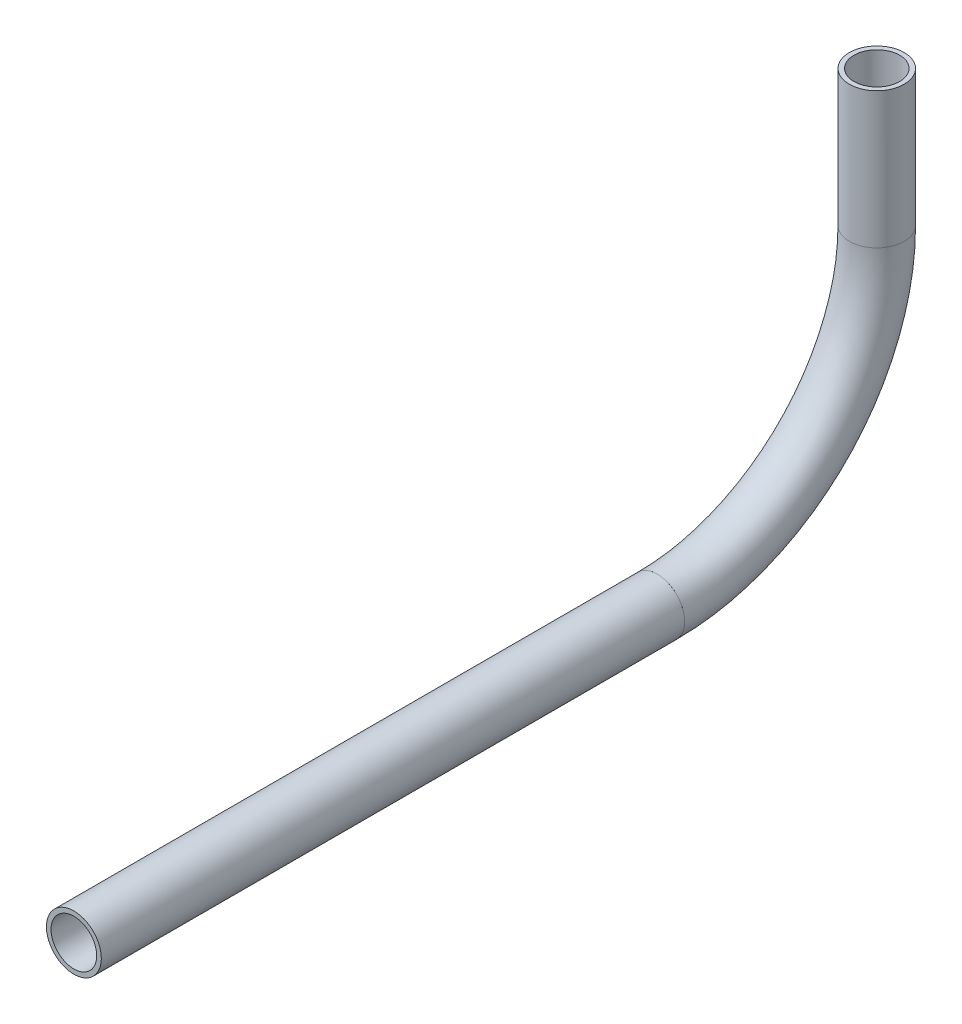
ISO-10303-21;
HEADER;
FILE_DESCRIPTION(('STEP AP214'),'2;1');
FILE_NAME('part.step','',(''),(''),'','','');
FILE_SCHEMA(('AUTOMOTIVE_DESIGN { 1 0 10303 214 1 1 1 1 }'));
ENDSEC;
DATA;
#1=APPLICATION_CONTEXT('core data for automotive mechanical design processes');
#2=APPLICATION_PROTOCOL_DEFINITION('international standard','automotive_design',2000,#1);
#3=PRODUCT_CONTEXT('',#1,'mechanical');
#4=PRODUCT('Part','Part','',(#3));
#5=PRODUCT_RELATED_PRODUCT_CATEGORY('part','',(#4));
#6=PRODUCT_DEFINITION_FORMATION('','',#4);
#7=PRODUCT_DEFINITION_CONTEXT('part definition',#1,'design');
#8=PRODUCT_DEFINITION('design','',#6,#7);
#9=PRODUCT_DEFINITION_SHAPE('','',#8);
#10=(LENGTH_UNIT() NAMED_UNIT(*) SI_UNIT(.MILLI.,.METRE.));
#11=(NAMED_UNIT(*) PLANE_ANGLE_UNIT() SI_UNIT($,.RADIAN.));
#12=(NAMED_UNIT(*) SI_UNIT($,.STERADIAN.) SOLID_ANGLE_UNIT());
#13=UNCERTAINTY_MEASURE_WITH_UNIT(LENGTH_MEASURE(1.E-05),#10,'distance_accuracy_value','');
#14=(GEOMETRIC_REPRESENTATION_CONTEXT(3) GLOBAL_UNCERTAINTY_ASSIGNED_CONTEXT((#13)) GLOBAL_UNIT_ASSIGNED_CONTEXT((#10,
#11,#12)) REPRESENTATION_CONTEXT('',''));
#15=CARTESIAN_POINT('',(0.,0.,0.));
#16=DIRECTION('',(0.,0.,1.));
#17=DIRECTION('',(1.,0.,0.));
#18=AXIS2_PLACEMENT_3D('',#15,#16,#17);
#19=CARTESIAN_POINT('',(0.,670.165576631268,168.173580131087));
#20=DIRECTION('',(0.,0.,1.));
#21=DIRECTION('',(0.,-1.,0.));
#22=AXIS2_PLACEMENT_3D('',#19,#20,#21);
#23=CYLINDRICAL_SURFACE('',#22,5.28320000000004);
#24=CARTESIAN_POINT('',(0.,670.165576631268,303.16459571102));
#25=DIRECTION('',(0.,0.,-1.));
#26=DIRECTION('',(0.,1.,0.));
#27=AXIS2_PLACEMENT_3D('',#24,#25,#26);
#28=CIRCLE('',#27,5.28320000000004);
#29=CARTESIAN_POINT('',(0.,675.448776631268,303.16459571102));
#30=VERTEX_POINT('',#29);
#31=EDGE_CURVE('E54',#30,#30,#28,.T.);
#32=ORIENTED_EDGE('',*,*,#31,.F.);
#33=EDGE_LOOP('',(#32));
#34=FACE_BOUND('',#33,.T.);
#35=CARTESIAN_POINT('',(0.,670.165576631268,168.173580131087));
#36=DIRECTION('',(0.,0.,-1.));
#37=DIRECTION('',(0.,1.,0.));
#38=AXIS2_PLACEMENT_3D('',#35,#36,#37);
#39=CIRCLE('',#38,5.28320000000004);
#40=CARTESIAN_POINT('',(0.,675.448776631268,168.173580131087));
#41=VERTEX_POINT('',#40);
#42=EDGE_CURVE('E50',#41,#41,#39,.T.);
#43=ORIENTED_EDGE('',*,*,#42,.T.);
#44=EDGE_LOOP('',(#43));
#45=FACE_BOUND('',#44,.T.);
#46=ADVANCED_FACE('F46',(#34,#45),#23,.F.);
#47=CARTESIAN_POINT('',(0.,670.165576631268,168.173580131087));
#48=DIRECTION('',(0.,0.,1.));
#49=DIRECTION('',(0.,-1.,0.));
#50=AXIS2_PLACEMENT_3D('',#47,#48,#49);
#51=CYLINDRICAL_SURFACE('',#50,6.35000000000005);
#52=CARTESIAN_POINT('',(0.,670.165576631268,303.16459571102));
#53=DIRECTION('',(0.,0.,-1.));
#54=DIRECTION('',(0.,1.,0.));
#55=AXIS2_PLACEMENT_3D('',#52,#53,#54);
#56=CIRCLE('',#55,6.35000000000005);
#57=CARTESIAN_POINT('',(0.,676.515576631268,303.16459571102));
#58=VERTEX_POINT('',#57);
#59=EDGE_CURVE('E58',#58,#58,#56,.T.);
#60=ORIENTED_EDGE('',*,*,#59,.T.);
#61=EDGE_LOOP('',(#60));
#62=FACE_BOUND('',#61,.T.);
#63=CARTESIAN_POINT('',(0.,670.165576631268,168.173580131087));
#64=DIRECTION('',(0.,0.,-1.));
#65=DIRECTION('',(0.,1.,0.));
#66=AXIS2_PLACEMENT_3D('',#63,#64,#65);
#67=CIRCLE('',#66,6.35000000000005);
#68=CARTESIAN_POINT('',(0.,676.515576631268,168.173580131087));
#69=VERTEX_POINT('',#68);
#70=EDGE_CURVE('E12',#69,#69,#67,.T.);
#71=ORIENTED_EDGE('',*,*,#70,.F.);
#72=EDGE_LOOP('',(#71));
#73=FACE_BOUND('',#72,.T.);
#74=ADVANCED_FACE('F73',(#62,#73),#51,.T.);
#75=CARTESIAN_POINT('',(0.,670.165576631268,303.16459571102));
#76=DIRECTION('',(0.,0.,-1.));
#77=DIRECTION('',(0.,1.,0.));
#78=AXIS2_PLACEMENT_3D('',#75,#76,#77);
#79=PLANE('',#78);
#80=ORIENTED_EDGE('',*,*,#31,.T.);
#81=EDGE_LOOP('',(#80));
#82=FACE_BOUND('',#81,.T.);
#83=ORIENTED_EDGE('',*,*,#59,.F.);
#84=EDGE_LOOP('',(#83));
#85=FACE_BOUND('',#84,.T.);
#86=ADVANCED_FACE('F69',(#82,#85),#79,.F.);
#87=CARTESIAN_POINT('',(0.,670.165576631268,168.173580131087));
#88=DIRECTION('',(0.,0.,-1.));
#89=DIRECTION('',(0.,1.,0.));
#90=AXIS2_PLACEMENT_3D('',#87,#88,#89);
#91=PLANE('',#90);
#92=ORIENTED_EDGE('',*,*,#42,.F.);
#93=EDGE_LOOP('',(#92));
#94=FACE_BOUND('',#93,.T.);
#95=ORIENTED_EDGE('',*,*,#70,.T.);
#96=EDGE_LOOP('',(#95));
#97=FACE_BOUND('',#96,.T.);
#98=ADVANCED_FACE('F48',(#94,#97),#91,.T.);
#99=CLOSED_SHELL('',(#46,#74,#86,#98));
#100=MANIFOLD_SOLID_BREP('B2',#99);
#101=CARTESIAN_POINT('',(0.,720.965576631268,168.173580131087));
#102=DIRECTION('',(-1.,0.,0.));
#103=DIRECTION('',(0.,0.,1.));
#104=AXIS2_PLACEMENT_3D('',#101,#102,#103);
#105=TOROIDAL_SURFACE('',#104,50.8000000000001,5.28320000000004);
#106=CARTESIAN_POINT('',(0.,720.965576631268,117.373580131087));
#107=DIRECTION('',(0.,1.,0.));
#108=DIRECTION('',(0.,0.,1.));
#109=AXIS2_PLACEMENT_3D('',#106,#107,#108);
#110=CIRCLE('',#109,5.28320000000004);
#111=CARTESIAN_POINT('',(0.,720.965576631268,112.090380131087));
#112=VERTEX_POINT('',#111);
#113=EDGE_CURVE('E149',#112,#112,#110,.T.);
#114=CARTESIAN_POINT('',(0.,670.165576631268,168.173580131087));
#115=DIRECTION('',(0.,0.,1.));
#116=DIRECTION('',(0.,-1.,0.));
#117=AXIS2_PLACEMENT_3D('',#114,#115,#116);
#118=CIRCLE('',#117,5.28320000000004);
#119=CARTESIAN_POINT('',(0.,664.882376631268,168.173580131087));
#120=VERTEX_POINT('',#119);
#121=EDGE_CURVE('E139',#120,#120,#118,.T.);
#122=CARTESIAN_POINT('',(0.,720.965576631268,168.173580131087));
#123=DIRECTION('',(-1.,0.,0.));
#124=DIRECTION('',(0.,0.,1.));
#125=AXIS2_PLACEMENT_3D('',#122,#123,#124);
#126=CIRCLE('',#125,56.0832000000001);
#127=EDGE_CURVE('',#112,#120,#126,.T.);
#128=ORIENTED_EDGE('',*,*,#113,.T.);
#129=ORIENTED_EDGE('',*,*,#121,.T.);
#130=ORIENTED_EDGE('',*,*,#127,.T.);
#131=ORIENTED_EDGE('',*,*,#127,.F.);
#132=EDGE_LOOP('',(#128,#130,#129,#131));
#133=FACE_BOUND('',#132,.T.);
#134=ADVANCED_FACE('F135',(#133),#105,.F.);
#135=CARTESIAN_POINT('',(0.,720.965576631268,168.173580131087));
#136=DIRECTION('',(-1.,0.,0.));
#137=DIRECTION('',(0.,0.,1.));
#138=AXIS2_PLACEMENT_3D('',#135,#136,#137);
#139=TOROIDAL_SURFACE('',#138,50.8000000000001,6.35000000000005);
#140=CARTESIAN_POINT('',(0.,720.965576631268,117.373580131087));
#141=DIRECTION('',(0.,1.,0.));
#142=DIRECTION('',(0.,0.,1.));
#143=AXIS2_PLACEMENT_3D('',#140,#141,#142);
#144=CIRCLE('',#143,6.35000000000005);
#145=CARTESIAN_POINT('',(0.,720.965576631268,111.023580131087));
#146=VERTEX_POINT('',#145);
#147=EDGE_CURVE('E143',#146,#146,#144,.T.);
#148=CARTESIAN_POINT('',(0.,670.165576631268,168.173580131087));
#149=DIRECTION('',(0.,0.,1.));
#150=DIRECTION('',(0.,-1.,0.));
#151=AXIS2_PLACEMENT_3D('',#148,#149,#150);
#152=CIRCLE('',#151,6.35000000000005);
#153=CARTESIAN_POINT('',(0.,663.815576631268,168.173580131087));
#154=VERTEX_POINT('',#153);
#155=EDGE_CURVE('E45',#154,#154,#152,.T.);
#156=CARTESIAN_POINT('',(0.,720.965576631268,168.173580131087));
#157=DIRECTION('',(-1.,0.,0.));
#158=DIRECTION('',(0.,0.,1.));
#159=AXIS2_PLACEMENT_3D('',#156,#157,#158);
#160=CIRCLE('',#159,57.1500000000001);
#161=EDGE_CURVE('',#146,#154,#160,.T.);
#162=ORIENTED_EDGE('',*,*,#147,.F.);
#163=ORIENTED_EDGE('',*,*,#155,.F.);
#164=ORIENTED_EDGE('',*,*,#161,.T.);
#165=ORIENTED_EDGE('',*,*,#161,.F.);
#166=EDGE_LOOP('',(#162,#164,#163,#165));
#167=FACE_BOUND('',#166,.T.);
#168=ADVANCED_FACE('F162',(#167),#139,.T.);
#169=CARTESIAN_POINT('',(0.,720.965576631268,117.373580131087));
#170=DIRECTION('',(0.,1.,0.));
#171=DIRECTION('',(0.,0.,1.));
#172=AXIS2_PLACEMENT_3D('',#169,#170,#171);
#173=PLANE('',#172);
#174=ORIENTED_EDGE('',*,*,#113,.F.);
#175=EDGE_LOOP('',(#174));
#176=FACE_BOUND('',#175,.T.);
#177=ORIENTED_EDGE('',*,*,#147,.T.);
#178=EDGE_LOOP('',(#177));
#179=FACE_BOUND('',#178,.T.);
#180=ADVANCED_FACE('F158',(#176,#179),#173,.T.);
#181=CARTESIAN_POINT('',(0.,670.165576631268,168.173580131087));
#182=DIRECTION('',(0.,0.,1.));
#183=DIRECTION('',(0.,-1.,0.));
#184=AXIS2_PLACEMENT_3D('',#181,#182,#183);
#185=PLANE('',#184);
#186=ORIENTED_EDGE('',*,*,#121,.F.);
#187=EDGE_LOOP('',(#186));
#188=FACE_BOUND('',#187,.T.);
#189=ORIENTED_EDGE('',*,*,#155,.T.);
#190=EDGE_LOOP('',(#189));
#191=FACE_BOUND('',#190,.T.);
#192=ADVANCED_FACE('F137',(#188,#191),#185,.T.);
#193=CLOSED_SHELL('',(#134,#168,#180,#192));
#194=MANIFOLD_SOLID_BREP('B7',#193);
#195=CARTESIAN_POINT('',(0.,752.458618261262,117.373580131087));
#196=DIRECTION('',(0.,-1.,0.));
#197=DIRECTION('',(0.,0.,-1.));
#198=AXIS2_PLACEMENT_3D('',#195,#196,#197);
#199=CYLINDRICAL_SURFACE('',#198,5.28320000000004);
#200=CARTESIAN_POINT('',(0.,752.458618261262,117.373580131087));
#201=DIRECTION('',(0.,1.,0.));
#202=DIRECTION('',(0.,0.,1.));
#203=AXIS2_PLACEMENT_3D('',#200,#201,#202);
#204=CIRCLE('',#203,5.28320000000004);
#205=CARTESIAN_POINT('',(0.,752.458618261262,122.656780131087));
#206=VERTEX_POINT('',#205);
#207=EDGE_CURVE('E233',#206,#206,#204,.T.);
#208=ORIENTED_EDGE('',*,*,#207,.T.);
#209=EDGE_LOOP('',(#208));
#210=FACE_BOUND('',#209,.T.);
#211=CARTESIAN_POINT('',(0.,720.965576631268,117.373580131087));
#212=DIRECTION('',(0.,-1.,0.));
#213=DIRECTION('',(0.,0.,-1.));
#214=AXIS2_PLACEMENT_3D('',#211,#212,#213);
#215=CIRCLE('',#214,5.28320000000004);
#216=CARTESIAN_POINT('',(0.,720.965576631268,112.090380131087));
#217=VERTEX_POINT('',#216);
#218=EDGE_CURVE('E223',#217,#217,#215,.T.);
#219=ORIENTED_EDGE('',*,*,#218,.T.);
#220=EDGE_LOOP('',(#219));
#221=FACE_BOUND('',#220,.T.);
#222=ADVANCED_FACE('F219',(#210,#221),#199,.F.);
#223=CARTESIAN_POINT('',(0.,752.458618261262,117.373580131087));
#224=DIRECTION('',(0.,-1.,0.));
#225=DIRECTION('',(0.,0.,-1.));
#226=AXIS2_PLACEMENT_3D('',#223,#224,#225);
#227=CYLINDRICAL_SURFACE('',#226,6.35000000000005);
#228=CARTESIAN_POINT('',(0.,752.458618261262,117.373580131087));
#229=DIRECTION('',(0.,1.,0.));
#230=DIRECTION('',(0.,0.,1.));
#231=AXIS2_PLACEMENT_3D('',#228,#229,#230);
#232=CIRCLE('',#231,6.35000000000005);
#233=CARTESIAN_POINT('',(0.,752.458618261262,123.723580131087));
#234=VERTEX_POINT('',#233);
#235=EDGE_CURVE('E227',#234,#234,#232,.T.);
#236=ORIENTED_EDGE('',*,*,#235,.F.);
#237=EDGE_LOOP('',(#236));
#238=FACE_BOUND('',#237,.T.);
#239=CARTESIAN_POINT('',(0.,720.965576631268,117.373580131087));
#240=DIRECTION('',(0.,-1.,0.));
#241=DIRECTION('',(0.,0.,-1.));
#242=AXIS2_PLACEMENT_3D('',#239,#240,#241);
#243=CIRCLE('',#242,6.35000000000005);
#244=CARTESIAN_POINT('',(0.,720.965576631268,111.023580131087));
#245=VERTEX_POINT('',#244);
#246=EDGE_CURVE('E134',#245,#245,#243,.T.);
#247=ORIENTED_EDGE('',*,*,#246,.F.);
#248=EDGE_LOOP('',(#247));
#249=FACE_BOUND('',#248,.T.);
#250=ADVANCED_FACE('F246',(#238,#249),#227,.T.);
#251=CARTESIAN_POINT('',(0.,752.458618261262,117.373580131087));
#252=DIRECTION('',(0.,1.,0.));
#253=DIRECTION('',(0.,0.,1.));
#254=AXIS2_PLACEMENT_3D('',#251,#252,#253);
#255=PLANE('',#254);
#256=ORIENTED_EDGE('',*,*,#207,.F.);
#257=EDGE_LOOP('',(#256));
#258=FACE_BOUND('',#257,.T.);
#259=ORIENTED_EDGE('',*,*,#235,.T.);
#260=EDGE_LOOP('',(#259));
#261=FACE_BOUND('',#260,.T.);
#262=ADVANCED_FACE('F242',(#258,#261),#255,.T.);
#263=CARTESIAN_POINT('',(0.,720.965576631268,117.373580131087));
#264=DIRECTION('',(0.,-1.,0.));
#265=DIRECTION('',(0.,0.,-1.));
#266=AXIS2_PLACEMENT_3D('',#263,#264,#265);
#267=PLANE('',#266);
#268=ORIENTED_EDGE('',*,*,#218,.F.);
#269=EDGE_LOOP('',(#268));
#270=FACE_BOUND('',#269,.T.);
#271=ORIENTED_EDGE('',*,*,#246,.T.);
#272=EDGE_LOOP('',(#271));
#273=FACE_BOUND('',#272,.T.);
#274=ADVANCED_FACE('F221',(#270,#273),#267,.T.);
#275=CLOSED_SHELL('',(#222,#250,#262,#274));
#276=MANIFOLD_SOLID_BREP('B40',#275);
#277=ADVANCED_BREP_SHAPE_REPRESENTATION('',(#18,#100,#194,#276),#14);
#278=SHAPE_DEFINITION_REPRESENTATION(#9,#277);
ENDSEC;
END-ISO-10303-21;
